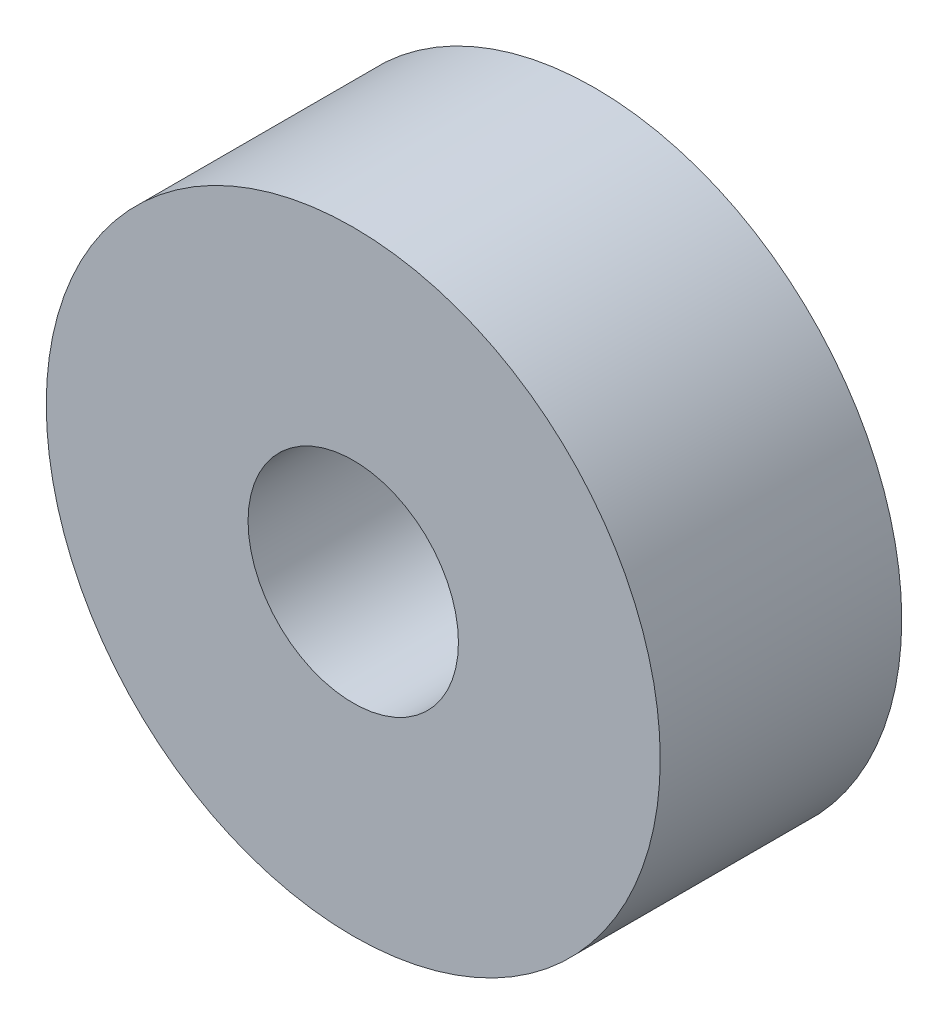
ISO-10303-21;
HEADER;
FILE_DESCRIPTION(('STEP AP214'),'2;1');
FILE_NAME('part.step','',(''),(''),'','','');
FILE_SCHEMA(('AUTOMOTIVE_DESIGN { 1 0 10303 214 1 1 1 1 }'));
ENDSEC;
DATA;
#1=APPLICATION_CONTEXT('core data for automotive mechanical design processes');
#2=APPLICATION_PROTOCOL_DEFINITION('international standard','automotive_design',2000,#1);
#3=PRODUCT_CONTEXT('',#1,'mechanical');
#4=PRODUCT('Part','Part','',(#3));
#5=PRODUCT_RELATED_PRODUCT_CATEGORY('part','',(#4));
#6=PRODUCT_DEFINITION_FORMATION('','',#4);
#7=PRODUCT_DEFINITION_CONTEXT('part definition',#1,'design');
#8=PRODUCT_DEFINITION('design','',#6,#7);
#9=PRODUCT_DEFINITION_SHAPE('','',#8);
#10=(LENGTH_UNIT() NAMED_UNIT(*) SI_UNIT(.MILLI.,.METRE.));
#11=(NAMED_UNIT(*) PLANE_ANGLE_UNIT() SI_UNIT($,.RADIAN.));
#12=(NAMED_UNIT(*) SI_UNIT($,.STERADIAN.) SOLID_ANGLE_UNIT());
#13=UNCERTAINTY_MEASURE_WITH_UNIT(LENGTH_MEASURE(1.E-05),#10,'distance_accuracy_value','');
#14=(GEOMETRIC_REPRESENTATION_CONTEXT(3) GLOBAL_UNCERTAINTY_ASSIGNED_CONTEXT((#13)) GLOBAL_UNIT_ASSIGNED_CONTEXT((#10,
#11,#12)) REPRESENTATION_CONTEXT('',''));
#15=CARTESIAN_POINT('',(0.,0.,0.));
#16=DIRECTION('',(0.,0.,1.));
#17=DIRECTION('',(1.,0.,0.));
#18=AXIS2_PLACEMENT_3D('',#15,#16,#17);
#19=CARTESIAN_POINT('',(0.,0.,-21.7308816762368));
#20=DIRECTION('',(0.,0.,-1.));
#21=DIRECTION('',(-1.,0.,0.));
#22=AXIS2_PLACEMENT_3D('',#19,#20,#21);
#23=CYLINDRICAL_SURFACE('',#22,9.525);
#24=CARTESIAN_POINT('',(0.,0.,3.7465));
#25=DIRECTION('',(0.,0.,-1.));
#26=DIRECTION('',(-1.,0.,0.));
#27=AXIS2_PLACEMENT_3D('',#24,#25,#26);
#28=CIRCLE('',#27,9.525);
#29=CARTESIAN_POINT('',(-9.525,0.,3.7465));
#30=VERTEX_POINT('',#29);
#31=EDGE_CURVE('E47',#30,#30,#28,.T.);
#32=ORIENTED_EDGE('',*,*,#31,.T.);
#33=EDGE_LOOP('',(#32));
#34=FACE_BOUND('',#33,.T.);
#35=CARTESIAN_POINT('',(0.,0.,-3.7465));
#36=DIRECTION('',(0.,0.,-1.));
#37=DIRECTION('',(-1.,0.,0.));
#38=AXIS2_PLACEMENT_3D('',#35,#36,#37);
#39=CIRCLE('',#38,9.525);
#40=CARTESIAN_POINT('',(-9.525,0.,-3.7465));
#41=VERTEX_POINT('',#40);
#42=EDGE_CURVE('E10',#41,#41,#39,.T.);
#43=ORIENTED_EDGE('',*,*,#42,.F.);
#44=EDGE_LOOP('',(#43));
#45=FACE_BOUND('',#44,.T.);
#46=ADVANCED_FACE('F33',(#34,#45),#23,.T.);
#47=CARTESIAN_POINT('',(0.,9.525,-3.7465));
#48=DIRECTION('',(0.,0.,-1.));
#49=DIRECTION('',(-1.,0.,0.));
#50=AXIS2_PLACEMENT_3D('',#47,#48,#49);
#51=PLANE('',#50);
#52=ORIENTED_EDGE('',*,*,#42,.T.);
#53=EDGE_LOOP('',(#52));
#54=FACE_BOUND('',#53,.T.);
#55=CARTESIAN_POINT('',(0.,0.,-3.7465));
#56=DIRECTION('',(0.,0.,-1.));
#57=DIRECTION('',(-1.,0.,0.));
#58=AXIS2_PLACEMENT_3D('',#55,#56,#57);
#59=CIRCLE('',#58,3.2639);
#60=CARTESIAN_POINT('',(-3.2639,0.,-3.7465));
#61=VERTEX_POINT('',#60);
#62=EDGE_CURVE('E39',#61,#61,#59,.T.);
#63=ORIENTED_EDGE('',*,*,#62,.F.);
#64=EDGE_LOOP('',(#63));
#65=FACE_BOUND('',#64,.T.);
#66=ADVANCED_FACE('F63',(#54,#65),#51,.T.);
#67=CARTESIAN_POINT('',(0.,0.,-21.7308816762368));
#68=DIRECTION('',(0.,0.,-1.));
#69=DIRECTION('',(-1.,0.,0.));
#70=AXIS2_PLACEMENT_3D('',#67,#68,#69);
#71=CYLINDRICAL_SURFACE('',#70,3.2639);
#72=ORIENTED_EDGE('',*,*,#62,.T.);
#73=EDGE_LOOP('',(#72));
#74=FACE_BOUND('',#73,.T.);
#75=CARTESIAN_POINT('',(0.,0.,3.7465));
#76=DIRECTION('',(0.,0.,-1.));
#77=DIRECTION('',(-1.,0.,0.));
#78=AXIS2_PLACEMENT_3D('',#75,#76,#77);
#79=CIRCLE('',#78,3.2639);
#80=CARTESIAN_POINT('',(-3.2639,0.,3.7465));
#81=VERTEX_POINT('',#80);
#82=EDGE_CURVE('E43',#81,#81,#79,.T.);
#83=ORIENTED_EDGE('',*,*,#82,.F.);
#84=EDGE_LOOP('',(#83));
#85=FACE_BOUND('',#84,.T.);
#86=ADVANCED_FACE('F57',(#74,#85),#71,.F.);
#87=CARTESIAN_POINT('',(0.,9.525,3.7465));
#88=DIRECTION('',(0.,0.,1.));
#89=DIRECTION('',(1.,0.,0.));
#90=AXIS2_PLACEMENT_3D('',#87,#88,#89);
#91=PLANE('',#90);
#92=ORIENTED_EDGE('',*,*,#82,.T.);
#93=EDGE_LOOP('',(#92));
#94=FACE_BOUND('',#93,.T.);
#95=ORIENTED_EDGE('',*,*,#31,.F.);
#96=EDGE_LOOP('',(#95));
#97=FACE_BOUND('',#96,.T.);
#98=ADVANCED_FACE('F55',(#94,#97),#91,.T.);
#99=CLOSED_SHELL('',(#46,#66,#86,#98));
#100=MANIFOLD_SOLID_BREP('B2',#99);
#101=ADVANCED_BREP_SHAPE_REPRESENTATION('',(#18,#100),#14);
#102=SHAPE_DEFINITION_REPRESENTATION(#9,#101);
ENDSEC;
END-ISO-10303-21;
